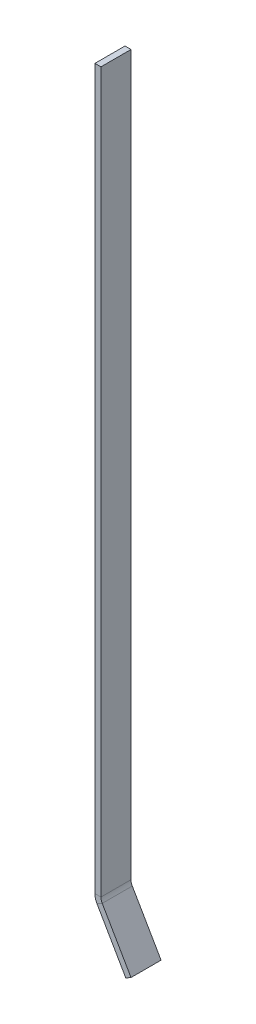
ISO-10303-21;
HEADER;
FILE_DESCRIPTION(('STEP AP214'),'2;1');
FILE_NAME('part.step','',(''),(''),'','','');
FILE_SCHEMA(('AUTOMOTIVE_DESIGN { 1 0 10303 214 1 1 1 1 }'));
ENDSEC;
DATA;
#1=APPLICATION_CONTEXT('core data for automotive mechanical design processes');
#2=APPLICATION_PROTOCOL_DEFINITION('international standard','automotive_design',2000,#1);
#3=PRODUCT_CONTEXT('',#1,'mechanical');
#4=PRODUCT('Part','Part','',(#3));
#5=PRODUCT_RELATED_PRODUCT_CATEGORY('part','',(#4));
#6=PRODUCT_DEFINITION_FORMATION('','',#4);
#7=PRODUCT_DEFINITION_CONTEXT('part definition',#1,'design');
#8=PRODUCT_DEFINITION('design','',#6,#7);
#9=PRODUCT_DEFINITION_SHAPE('','',#8);
#10=(LENGTH_UNIT() NAMED_UNIT(*) SI_UNIT(.MILLI.,.METRE.));
#11=(NAMED_UNIT(*) PLANE_ANGLE_UNIT() SI_UNIT($,.RADIAN.));
#12=(NAMED_UNIT(*) SI_UNIT($,.STERADIAN.) SOLID_ANGLE_UNIT());
#13=UNCERTAINTY_MEASURE_WITH_UNIT(LENGTH_MEASURE(1.E-05),#10,'distance_accuracy_value','');
#14=(GEOMETRIC_REPRESENTATION_CONTEXT(3) GLOBAL_UNCERTAINTY_ASSIGNED_CONTEXT((#13)) GLOBAL_UNIT_ASSIGNED_CONTEXT((#10,
#11,#12)) REPRESENTATION_CONTEXT('',''));
#15=CARTESIAN_POINT('',(0.,0.,0.));
#16=DIRECTION('',(0.,0.,1.));
#17=DIRECTION('',(1.,0.,0.));
#18=AXIS2_PLACEMENT_3D('',#15,#16,#17);
#19=CARTESIAN_POINT('',(1.07179676972519,-601.856406460553,24.9999999999998));
#20=DIRECTION('',(0.,0.,0.999999999999997));
#21=DIRECTION('',(1.00000000000001,0.,0.));
#22=AXIS2_PLACEMENT_3D('',#19,#20,#21);
#23=PLANE('',#22);
#24=DIRECTION('',(-0.866025403784439,-0.500000000000011,0.));
#25=VECTOR('',#24,1.);
#26=CARTESIAN_POINT('',(1.07179676972519,-601.856406460553,24.9999999999998));
#27=LINE('',#26,#25);
#28=CARTESIAN_POINT('',(1.07179676972519,-601.856406460553,24.9999999999998));
#29=VERTEX_POINT('',#28);
#30=CARTESIAN_POINT('',(-3.25833024919744,-604.356406460554,24.9999999999998));
#31=VERTEX_POINT('',#30);
#32=EDGE_CURVE('E11',#29,#31,#27,.T.);
#33=ORIENTED_EDGE('',*,*,#32,.F.);
#34=CARTESIAN_POINT('',(8.0000000000004,-597.856406460554,24.9999999999998));
#35=DIRECTION('',(0.,0.,-0.999999999999997));
#36=DIRECTION('',(-1.00000000000001,0.,0.));
#37=AXIS2_PLACEMENT_3D('',#34,#35,#36);
#38=CIRCLE('',#37,8.);
#39=CARTESIAN_POINT('',(4.71844785465692E-13,-597.856406460554,24.9999999999998));
#40=VERTEX_POINT('',#39);
#41=EDGE_CURVE('E133',#40,#29,#38,.F.);
#42=ORIENTED_EDGE('',*,*,#41,.F.);
#43=DIRECTION('',(1.00000000000001,0.,0.));
#44=VECTOR('',#43,1.);
#45=CARTESIAN_POINT('',(-4.99999999999978,-597.856406460554,24.9999999999998));
#46=LINE('',#45,#44);
#47=CARTESIAN_POINT('',(-4.99999999999978,-597.856406460554,24.9999999999998));
#48=VERTEX_POINT('',#47);
#49=EDGE_CURVE('E44',#48,#40,#46,.T.);
#50=ORIENTED_EDGE('',*,*,#49,.F.);
#51=CARTESIAN_POINT('',(8.0000000000004,-597.856406460554,24.9999999999998));
#52=DIRECTION('',(0.,0.,0.999999999999997));
#53=DIRECTION('',(1.00000000000001,0.,0.));
#54=AXIS2_PLACEMENT_3D('',#51,#52,#53);
#55=CIRCLE('',#54,13.);
#56=EDGE_CURVE('E126',#48,#31,#55,.T.);
#57=ORIENTED_EDGE('',*,*,#56,.T.);
#58=EDGE_LOOP('',(#33,#42,#50,#57));
#59=FACE_BOUND('',#58,.T.);
#60=ADVANCED_FACE('F36',(#59),#23,.T.);
#61=CARTESIAN_POINT('',(-4.99999999999978,-597.856406460554,24.9999999999998));
#62=DIRECTION('',(0.,0.,0.999999999999997));
#63=DIRECTION('',(1.00000000000001,0.,0.));
#64=AXIS2_PLACEMENT_3D('',#61,#62,#63);
#65=PLANE('',#64);
#66=DIRECTION('',(0.500000000000004,-0.866025403784442,0.));
#67=VECTOR('',#66,1.);
#68=CARTESIAN_POINT('',(3.88578058618805E-13,-600.000000000003,24.9999999999998));
#69=LINE('',#68,#67);
#70=CARTESIAN_POINT('',(25.0000000000006,-643.301270189225,24.9999999999993));
#71=VERTEX_POINT('',#70);
#72=EDGE_CURVE('E182',#29,#71,#69,.T.);
#73=ORIENTED_EDGE('',*,*,#72,.F.);
#74=ORIENTED_EDGE('',*,*,#32,.T.);
#75=DIRECTION('',(0.500000000000004,-0.866025403784442,0.));
#76=VECTOR('',#75,1.);
#77=CARTESIAN_POINT('',(-4.3301270189218,-602.500000000003,24.9999999999998));
#78=LINE('',#77,#76);
#79=CARTESIAN_POINT('',(20.6698729810786,-645.801270189224,24.9999999999993));
#80=VERTEX_POINT('',#79);
#81=EDGE_CURVE('E92',#31,#80,#78,.T.);
#82=ORIENTED_EDGE('',*,*,#81,.T.);
#83=DIRECTION('',(-0.86602540378444,-0.50000000000001,0.));
#84=VECTOR('',#83,1.);
#85=CARTESIAN_POINT('',(25.0000000000006,-643.301270189225,24.9999999999993));
#86=LINE('',#85,#84);
#87=EDGE_CURVE('E339',#71,#80,#86,.T.);
#88=ORIENTED_EDGE('',*,*,#87,.F.);
#89=EDGE_LOOP('',(#73,#74,#82,#88));
#90=FACE_BOUND('',#89,.T.);
#91=ADVANCED_FACE('F190',(#90),#65,.T.);
#92=CARTESIAN_POINT('',(4.71844785465692E-13,-597.856406460554,-2.22044604925031E-13));
#93=DIRECTION('',(0.,0.,-0.999999999999997));
#94=DIRECTION('',(-1.00000000000001,0.,0.));
#95=AXIS2_PLACEMENT_3D('',#92,#93,#94);
#96=PLANE('',#95);
#97=DIRECTION('',(-1.00000000000001,0.,0.));
#98=VECTOR('',#97,1.);
#99=CARTESIAN_POINT('',(4.71844785465692E-13,-597.856406460554,-2.22044604925031E-13));
#100=LINE('',#99,#98);
#101=CARTESIAN_POINT('',(4.71844785465692E-13,-597.856406460554,-2.22044604925031E-13));
#102=VERTEX_POINT('',#101);
#103=CARTESIAN_POINT('',(-4.99999999999978,-597.856406460554,-2.22044604925031E-13));
#104=VERTEX_POINT('',#103);
#105=EDGE_CURVE('E79',#102,#104,#100,.T.);
#106=ORIENTED_EDGE('',*,*,#105,.F.);
#107=CARTESIAN_POINT('',(8.0000000000004,-597.856406460554,-2.22044604925031E-13));
#108=DIRECTION('',(0.,0.,-0.999999999999997));
#109=DIRECTION('',(-1.00000000000001,0.,0.));
#110=AXIS2_PLACEMENT_3D('',#107,#108,#109);
#111=CIRCLE('',#110,8.);
#112=CARTESIAN_POINT('',(1.07179676972502,-601.856406460554,-2.22044604925031E-13));
#113=VERTEX_POINT('',#112);
#114=EDGE_CURVE('E148',#102,#113,#111,.F.);
#115=ORIENTED_EDGE('',*,*,#114,.T.);
#116=DIRECTION('',(0.866025403784439,0.500000000000011,0.));
#117=VECTOR('',#116,1.);
#118=CARTESIAN_POINT('',(-3.25833024919744,-604.356406460554,-2.22044604925031E-13));
#119=LINE('',#118,#117);
#120=CARTESIAN_POINT('',(-3.25833024919744,-604.356406460554,-2.22044604925031E-13));
#121=VERTEX_POINT('',#120);
#122=EDGE_CURVE('E86',#121,#113,#119,.T.);
#123=ORIENTED_EDGE('',*,*,#122,.F.);
#124=CARTESIAN_POINT('',(8.0000000000004,-597.856406460554,-2.22044604925031E-13));
#125=DIRECTION('',(0.,0.,0.999999999999997));
#126=DIRECTION('',(1.00000000000001,0.,0.));
#127=AXIS2_PLACEMENT_3D('',#124,#125,#126);
#128=CIRCLE('',#127,13.);
#129=EDGE_CURVE('E155',#104,#121,#128,.T.);
#130=ORIENTED_EDGE('',*,*,#129,.F.);
#131=EDGE_LOOP('',(#106,#115,#123,#130));
#132=FACE_BOUND('',#131,.T.);
#133=ADVANCED_FACE('F188',(#132),#96,.T.);
#134=CARTESIAN_POINT('',(-3.25833024919744,-604.356406460554,-2.22044604925031E-13));
#135=DIRECTION('',(0.,0.,-0.999999999999997));
#136=DIRECTION('',(-1.00000000000001,0.,0.));
#137=AXIS2_PLACEMENT_3D('',#134,#135,#136);
#138=PLANE('',#137);
#139=DIRECTION('',(0.,-1.,0.));
#140=VECTOR('',#139,1.);
#141=CARTESIAN_POINT('',(0.,0.,0.));
#142=LINE('',#141,#140);
#143=CARTESIAN_POINT('',(0.,0.,0.));
#144=VERTEX_POINT('',#143);
#145=EDGE_CURVE('E150',#144,#102,#142,.T.);
#146=ORIENTED_EDGE('',*,*,#145,.T.);
#147=ORIENTED_EDGE('',*,*,#105,.T.);
#148=DIRECTION('',(0.,-1.,0.));
#149=VECTOR('',#148,1.);
#150=CARTESIAN_POINT('',(-4.99999999999984,-1.11022302462516E-13,0.));
#151=LINE('',#150,#149);
#152=CARTESIAN_POINT('',(-4.99999999999984,-1.11022302462516E-13,0.));
#153=VERTEX_POINT('',#152);
#154=EDGE_CURVE('E153',#153,#104,#151,.T.);
#155=ORIENTED_EDGE('',*,*,#154,.F.);
#156=DIRECTION('',(1.00000000000001,0.,0.));
#157=VECTOR('',#156,1.);
#158=CARTESIAN_POINT('',(-4.99999999999984,-1.11022302462516E-13,0.));
#159=LINE('',#158,#157);
#160=EDGE_CURVE('E114',#153,#144,#159,.T.);
#161=ORIENTED_EDGE('',*,*,#160,.T.);
#162=EDGE_LOOP('',(#146,#147,#155,#161));
#163=FACE_BOUND('',#162,.T.);
#164=ADVANCED_FACE('F184',(#163),#138,.T.);
#165=CARTESIAN_POINT('',(-4.3301270189218,-602.500000000003,24.9999999999998));
#166=DIRECTION('',(0.866025403784444,0.500000000000002,0.));
#167=DIRECTION('',(-0.500000000000004,0.866025403784442,0.));
#168=AXIS2_PLACEMENT_3D('',#165,#166,#167);
#169=PLANE('',#168);
#170=DIRECTION('',(0.500000000000004,-0.866025403784442,0.));
#171=VECTOR('',#170,1.);
#172=CARTESIAN_POINT('',(-4.33012701892177,-602.500000000003,-2.22044604925031E-13));
#173=LINE('',#172,#171);
#174=CARTESIAN_POINT('',(20.6698729810784,-645.801270189225,-6.66133814775094E-13));
#175=VERTEX_POINT('',#174);
#176=EDGE_CURVE('E139',#121,#175,#173,.T.);
#177=ORIENTED_EDGE('',*,*,#176,.T.);
#178=DIRECTION('',(0.,0.,-0.999999999999997));
#179=VECTOR('',#178,1.);
#180=CARTESIAN_POINT('',(20.6698729810786,-645.801270189224,24.9999999999993));
#181=LINE('',#180,#179);
#182=EDGE_CURVE('E169',#80,#175,#181,.T.);
#183=ORIENTED_EDGE('',*,*,#182,.F.);
#184=ORIENTED_EDGE('',*,*,#81,.F.);
#185=DIRECTION('',(0.,0.,-0.999999999999997));
#186=VECTOR('',#185,1.);
#187=CARTESIAN_POINT('',(-3.25833024919744,-604.356406460554,24.9999999999998));
#188=LINE('',#187,#186);
#189=EDGE_CURVE('E138',#31,#121,#188,.T.);
#190=ORIENTED_EDGE('',*,*,#189,.T.);
#191=EDGE_LOOP('',(#177,#183,#184,#190));
#192=FACE_BOUND('',#191,.T.);
#193=ADVANCED_FACE('F196',(#192),#169,.F.);
#194=CARTESIAN_POINT('',(25.0000000000006,-643.301270189225,24.9999999999993));
#195=DIRECTION('',(0.500000000000012,-0.866025403784438,0.));
#196=DIRECTION('',(0.866025403784438,0.50000000000001,0.));
#197=AXIS2_PLACEMENT_3D('',#194,#195,#196);
#198=PLANE('',#197);
#199=DIRECTION('',(-0.86602540378444,-0.50000000000001,0.));
#200=VECTOR('',#199,1.);
#201=CARTESIAN_POINT('',(25.0000000000006,-643.301270189225,-6.66133814775094E-13));
#202=LINE('',#201,#200);
#203=CARTESIAN_POINT('',(25.0000000000006,-643.301270189225,-6.66133814775094E-13));
#204=VERTEX_POINT('',#203);
#205=EDGE_CURVE('E142',#204,#175,#202,.T.);
#206=ORIENTED_EDGE('',*,*,#205,.F.);
#207=DIRECTION('',(0.,0.,-0.999999999999997));
#208=VECTOR('',#207,1.);
#209=CARTESIAN_POINT('',(25.0000000000006,-643.301270189225,24.9999999999993));
#210=LINE('',#209,#208);
#211=EDGE_CURVE('E167',#71,#204,#210,.T.);
#212=ORIENTED_EDGE('',*,*,#211,.F.);
#213=ORIENTED_EDGE('',*,*,#87,.T.);
#214=ORIENTED_EDGE('',*,*,#182,.T.);
#215=EDGE_LOOP('',(#206,#212,#213,#214));
#216=FACE_BOUND('',#215,.T.);
#217=ADVANCED_FACE('F227',(#216),#198,.T.);
#218=CARTESIAN_POINT('',(3.88578058618805E-13,-600.000000000003,24.9999999999998));
#219=DIRECTION('',(0.866025403784443,0.500000000000002,0.));
#220=DIRECTION('',(-0.500000000000004,0.866025403784442,0.));
#221=AXIS2_PLACEMENT_3D('',#218,#219,#220);
#222=PLANE('',#221);
#223=DIRECTION('',(0.500000000000004,-0.866025403784442,0.));
#224=VECTOR('',#223,1.);
#225=CARTESIAN_POINT('',(3.88578058618805E-13,-600.000000000003,-2.22044604925031E-13));
#226=LINE('',#225,#224);
#227=EDGE_CURVE('E145',#113,#204,#226,.T.);
#228=ORIENTED_EDGE('',*,*,#227,.F.);
#229=DIRECTION('',(0.,0.,-0.999999999999997));
#230=VECTOR('',#229,1.);
#231=CARTESIAN_POINT('',(1.07179676972519,-601.856406460553,24.9999999999998));
#232=LINE('',#231,#230);
#233=EDGE_CURVE('E164',#29,#113,#232,.T.);
#234=ORIENTED_EDGE('',*,*,#233,.F.);
#235=ORIENTED_EDGE('',*,*,#72,.T.);
#236=ORIENTED_EDGE('',*,*,#211,.T.);
#237=EDGE_LOOP('',(#228,#234,#235,#236));
#238=FACE_BOUND('',#237,.T.);
#239=ADVANCED_FACE('F238',(#238),#222,.T.);
#240=CARTESIAN_POINT('',(8.0000000000004,-597.856406460554,24.9999999999998));
#241=DIRECTION('',(0.,0.,-0.999999999999997));
#242=DIRECTION('',(-1.00000000000001,0.,0.));
#243=AXIS2_PLACEMENT_3D('',#240,#241,#242);
#244=CYLINDRICAL_SURFACE('',#243,8.);
#245=ORIENTED_EDGE('',*,*,#114,.F.);
#246=DIRECTION('',(0.,0.,-0.999999999999997));
#247=VECTOR('',#246,1.);
#248=CARTESIAN_POINT('',(4.71844785465692E-13,-597.856406460554,24.9999999999998));
#249=LINE('',#248,#247);
#250=EDGE_CURVE('E161',#40,#102,#249,.T.);
#251=ORIENTED_EDGE('',*,*,#250,.F.);
#252=ORIENTED_EDGE('',*,*,#41,.T.);
#253=ORIENTED_EDGE('',*,*,#233,.T.);
#254=EDGE_LOOP('',(#245,#251,#252,#253));
#255=FACE_BOUND('',#254,.T.);
#256=ADVANCED_FACE('F178',(#255),#244,.F.);
#257=CARTESIAN_POINT('',(2.22044604925031E-13,-2.22044604925031E-13,25.));
#258=DIRECTION('',(1.00000000000001,0.,0.));
#259=DIRECTION('',(0.,1.,0.));
#260=AXIS2_PLACEMENT_3D('',#257,#258,#259);
#261=PLANE('',#260);
#262=ORIENTED_EDGE('',*,*,#145,.F.);
#263=DIRECTION('',(0.,0.,-0.999999999999997));
#264=VECTOR('',#263,1.);
#265=CARTESIAN_POINT('',(2.22044604925031E-13,-2.22044604925031E-13,25.));
#266=LINE('',#265,#264);
#267=CARTESIAN_POINT('',(2.22044604925031E-13,-2.22044604925031E-13,25.));
#268=VERTEX_POINT('',#267);
#269=EDGE_CURVE('E116',#268,#144,#266,.T.);
#270=ORIENTED_EDGE('',*,*,#269,.F.);
#271=DIRECTION('',(0.,-1.,0.));
#272=VECTOR('',#271,1.);
#273=CARTESIAN_POINT('',(2.22044604925031E-13,-2.22044604925031E-13,25.));
#274=LINE('',#273,#272);
#275=EDGE_CURVE('E131',#268,#40,#274,.T.);
#276=ORIENTED_EDGE('',*,*,#275,.T.);
#277=ORIENTED_EDGE('',*,*,#250,.T.);
#278=EDGE_LOOP('',(#262,#270,#276,#277));
#279=FACE_BOUND('',#278,.T.);
#280=ADVANCED_FACE('F183',(#279),#261,.T.);
#281=CARTESIAN_POINT('',(-4.99999999999984,-1.11022302462516E-13,25.));
#282=DIRECTION('',(0.,1.,0.));
#283=DIRECTION('',(-1.00000000000001,0.,0.));
#284=AXIS2_PLACEMENT_3D('',#281,#282,#283);
#285=PLANE('',#284);
#286=ORIENTED_EDGE('',*,*,#160,.F.);
#287=DIRECTION('',(0.,0.,-0.999999999999997));
#288=VECTOR('',#287,1.);
#289=CARTESIAN_POINT('',(-4.99999999999984,-1.11022302462516E-13,25.));
#290=LINE('',#289,#288);
#291=CARTESIAN_POINT('',(-4.99999999999984,-1.11022302462516E-13,25.));
#292=VERTEX_POINT('',#291);
#293=EDGE_CURVE('E108',#292,#153,#290,.T.);
#294=ORIENTED_EDGE('',*,*,#293,.F.);
#295=DIRECTION('',(1.00000000000001,0.,0.));
#296=VECTOR('',#295,1.);
#297=CARTESIAN_POINT('',(-4.99999999999984,-1.11022302462516E-13,25.));
#298=LINE('',#297,#296);
#299=EDGE_CURVE('E112',#292,#268,#298,.T.);
#300=ORIENTED_EDGE('',*,*,#299,.T.);
#301=ORIENTED_EDGE('',*,*,#269,.T.);
#302=EDGE_LOOP('',(#286,#294,#300,#301));
#303=FACE_BOUND('',#302,.T.);
#304=ADVANCED_FACE('F110',(#303),#285,.T.);
#305=CARTESIAN_POINT('',(-4.99999999999984,-1.11022302462516E-13,25.));
#306=DIRECTION('',(1.00000000000001,0.,0.));
#307=DIRECTION('',(0.,1.,0.));
#308=AXIS2_PLACEMENT_3D('',#305,#306,#307);
#309=PLANE('',#308);
#310=ORIENTED_EDGE('',*,*,#154,.T.);
#311=DIRECTION('',(0.,0.,-0.999999999999997));
#312=VECTOR('',#311,1.);
#313=CARTESIAN_POINT('',(-4.99999999999978,-597.856406460554,24.9999999999998));
#314=LINE('',#313,#312);
#315=EDGE_CURVE('E117',#48,#104,#314,.T.);
#316=ORIENTED_EDGE('',*,*,#315,.F.);
#317=DIRECTION('',(0.,-1.,0.));
#318=VECTOR('',#317,1.);
#319=CARTESIAN_POINT('',(-4.99999999999984,-1.11022302462516E-13,25.));
#320=LINE('',#319,#318);
#321=EDGE_CURVE('E121',#292,#48,#320,.T.);
#322=ORIENTED_EDGE('',*,*,#321,.F.);
#323=ORIENTED_EDGE('',*,*,#293,.T.);
#324=EDGE_LOOP('',(#310,#316,#322,#323));
#325=FACE_BOUND('',#324,.T.);
#326=ADVANCED_FACE('F122',(#325),#309,.F.);
#327=CARTESIAN_POINT('',(8.0000000000004,-597.856406460554,24.9999999999998));
#328=DIRECTION('',(0.,0.,-0.999999999999997));
#329=DIRECTION('',(-1.00000000000001,0.,0.));
#330=AXIS2_PLACEMENT_3D('',#327,#328,#329);
#331=CYLINDRICAL_SURFACE('',#330,13.);
#332=ORIENTED_EDGE('',*,*,#129,.T.);
#333=ORIENTED_EDGE('',*,*,#189,.F.);
#334=ORIENTED_EDGE('',*,*,#56,.F.);
#335=ORIENTED_EDGE('',*,*,#315,.T.);
#336=EDGE_LOOP('',(#332,#333,#334,#335));
#337=FACE_BOUND('',#336,.T.);
#338=ADVANCED_FACE('F186',(#337),#331,.T.);
#339=CARTESIAN_POINT('',(8.0000000000004,-597.856406460554,24.9999999999998));
#340=DIRECTION('',(0.,0.,-0.999999999999997));
#341=DIRECTION('',(-1.00000000000001,0.,0.));
#342=AXIS2_PLACEMENT_3D('',#339,#340,#341);
#343=PLANE('',#342);
#344=ORIENTED_EDGE('',*,*,#321,.T.);
#345=ORIENTED_EDGE('',*,*,#49,.T.);
#346=ORIENTED_EDGE('',*,*,#275,.F.);
#347=ORIENTED_EDGE('',*,*,#299,.F.);
#348=EDGE_LOOP('',(#344,#345,#346,#347));
#349=FACE_BOUND('',#348,.T.);
#350=ADVANCED_FACE('F129',(#349),#343,.F.);
#351=CARTESIAN_POINT('',(8.0000000000004,-597.856406460554,-2.22044604925031E-13));
#352=DIRECTION('',(0.,0.,-0.999999999999997));
#353=DIRECTION('',(-1.00000000000001,0.,0.));
#354=AXIS2_PLACEMENT_3D('',#351,#352,#353);
#355=PLANE('',#354);
#356=ORIENTED_EDGE('',*,*,#176,.F.);
#357=ORIENTED_EDGE('',*,*,#122,.T.);
#358=ORIENTED_EDGE('',*,*,#227,.T.);
#359=ORIENTED_EDGE('',*,*,#205,.T.);
#360=EDGE_LOOP('',(#356,#357,#358,#359));
#361=FACE_BOUND('',#360,.T.);
#362=ADVANCED_FACE('F304',(#361),#355,.T.);
#363=CLOSED_SHELL('',(#60,#91,#133,#164,#193,#217,#239,#256,#280,#304,#326,#338,#350,#362));
#364=MANIFOLD_SOLID_BREP('B2',#363);
#365=ADVANCED_BREP_SHAPE_REPRESENTATION('',(#18,#364),#14);
#366=SHAPE_DEFINITION_REPRESENTATION(#9,#365);
ENDSEC;
END-ISO-10303-21;
